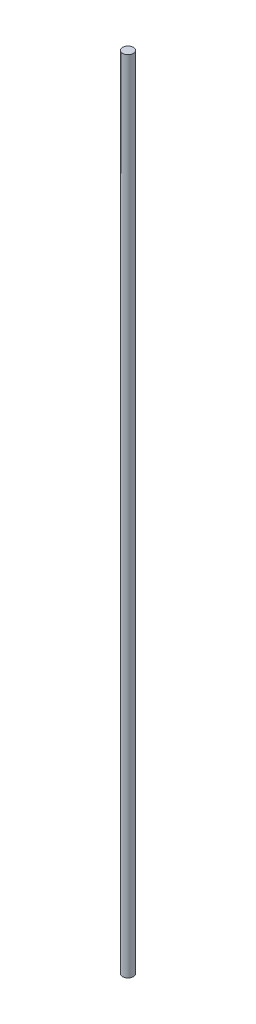
ISO-10303-21;
HEADER;
FILE_DESCRIPTION(('STEP AP214'),'2;1');
FILE_NAME('part.step','',(''),(''),'','','');
FILE_SCHEMA(('AUTOMOTIVE_DESIGN { 1 0 10303 214 1 1 1 1 }'));
ENDSEC;
DATA;
#1=APPLICATION_CONTEXT('core data for automotive mechanical design processes');
#2=APPLICATION_PROTOCOL_DEFINITION('international standard','automotive_design',2000,#1);
#3=PRODUCT_CONTEXT('',#1,'mechanical');
#4=PRODUCT('Part','Part','',(#3));
#5=PRODUCT_RELATED_PRODUCT_CATEGORY('part','',(#4));
#6=PRODUCT_DEFINITION_FORMATION('','',#4);
#7=PRODUCT_DEFINITION_CONTEXT('part definition',#1,'design');
#8=PRODUCT_DEFINITION('design','',#6,#7);
#9=PRODUCT_DEFINITION_SHAPE('','',#8);
#10=(LENGTH_UNIT() NAMED_UNIT(*) SI_UNIT(.MILLI.,.METRE.));
#11=(NAMED_UNIT(*) PLANE_ANGLE_UNIT() SI_UNIT($,.RADIAN.));
#12=(NAMED_UNIT(*) SI_UNIT($,.STERADIAN.) SOLID_ANGLE_UNIT());
#13=UNCERTAINTY_MEASURE_WITH_UNIT(LENGTH_MEASURE(1.E-05),#10,'distance_accuracy_value','');
#14=(GEOMETRIC_REPRESENTATION_CONTEXT(3) GLOBAL_UNCERTAINTY_ASSIGNED_CONTEXT((#13)) GLOBAL_UNIT_ASSIGNED_CONTEXT((#10,
#11,#12)) REPRESENTATION_CONTEXT('',''));
#15=CARTESIAN_POINT('',(0.,0.,0.));
#16=DIRECTION('',(0.,0.,1.));
#17=DIRECTION('',(1.,0.,0.));
#18=AXIS2_PLACEMENT_3D('',#15,#16,#17);
#19=CARTESIAN_POINT('',(0.,450.,0.));
#20=DIRECTION('',(0.,-1.,0.));
#21=DIRECTION('',(0.,0.,-1.));
#22=AXIS2_PLACEMENT_3D('',#19,#20,#21);
#23=CYLINDRICAL_SURFACE('',#22,3.);
#24=CARTESIAN_POINT('',(0.,450.,0.));
#25=DIRECTION('',(0.,1.,0.));
#26=DIRECTION('',(0.,0.,1.));
#27=AXIS2_PLACEMENT_3D('',#24,#25,#26);
#28=CIRCLE('',#27,3.);
#29=CARTESIAN_POINT('',(0.,450.,3.));
#30=VERTEX_POINT('',#29);
#31=EDGE_CURVE('E10',#30,#30,#28,.T.);
#32=ORIENTED_EDGE('',*,*,#31,.F.);
#33=EDGE_LOOP('',(#32));
#34=FACE_BOUND('',#33,.T.);
#35=CARTESIAN_POINT('',(0.,0.,0.));
#36=DIRECTION('',(0.,1.,0.));
#37=DIRECTION('',(0.,0.,1.));
#38=AXIS2_PLACEMENT_3D('',#35,#36,#37);
#39=CIRCLE('',#38,3.);
#40=CARTESIAN_POINT('',(0.,0.,3.));
#41=VERTEX_POINT('',#40);
#42=EDGE_CURVE('E38',#41,#41,#39,.T.);
#43=ORIENTED_EDGE('',*,*,#42,.T.);
#44=EDGE_LOOP('',(#43));
#45=FACE_BOUND('',#44,.T.);
#46=ADVANCED_FACE('F35',(#34,#45),#23,.T.);
#47=CARTESIAN_POINT('',(0.,450.,0.));
#48=DIRECTION('',(0.,1.,0.));
#49=DIRECTION('',(0.,0.,1.));
#50=AXIS2_PLACEMENT_3D('',#47,#48,#49);
#51=PLANE('',#50);
#52=ORIENTED_EDGE('',*,*,#31,.T.);
#53=EDGE_LOOP('',(#52));
#54=FACE_BOUND('',#53,.T.);
#55=ADVANCED_FACE('F50',(#54),#51,.T.);
#56=CARTESIAN_POINT('',(0.,0.,0.));
#57=DIRECTION('',(0.,1.,0.));
#58=DIRECTION('',(0.,0.,1.));
#59=AXIS2_PLACEMENT_3D('',#56,#57,#58);
#60=PLANE('',#59);
#61=ORIENTED_EDGE('',*,*,#42,.F.);
#62=EDGE_LOOP('',(#61));
#63=FACE_BOUND('',#62,.T.);
#64=ADVANCED_FACE('F48',(#63),#60,.F.);
#65=CLOSED_SHELL('',(#46,#55,#64));
#66=MANIFOLD_SOLID_BREP('B2',#65);
#67=ADVANCED_BREP_SHAPE_REPRESENTATION('',(#18,#66),#14);
#68=SHAPE_DEFINITION_REPRESENTATION(#9,#67);
ENDSEC;
END-ISO-10303-21;
